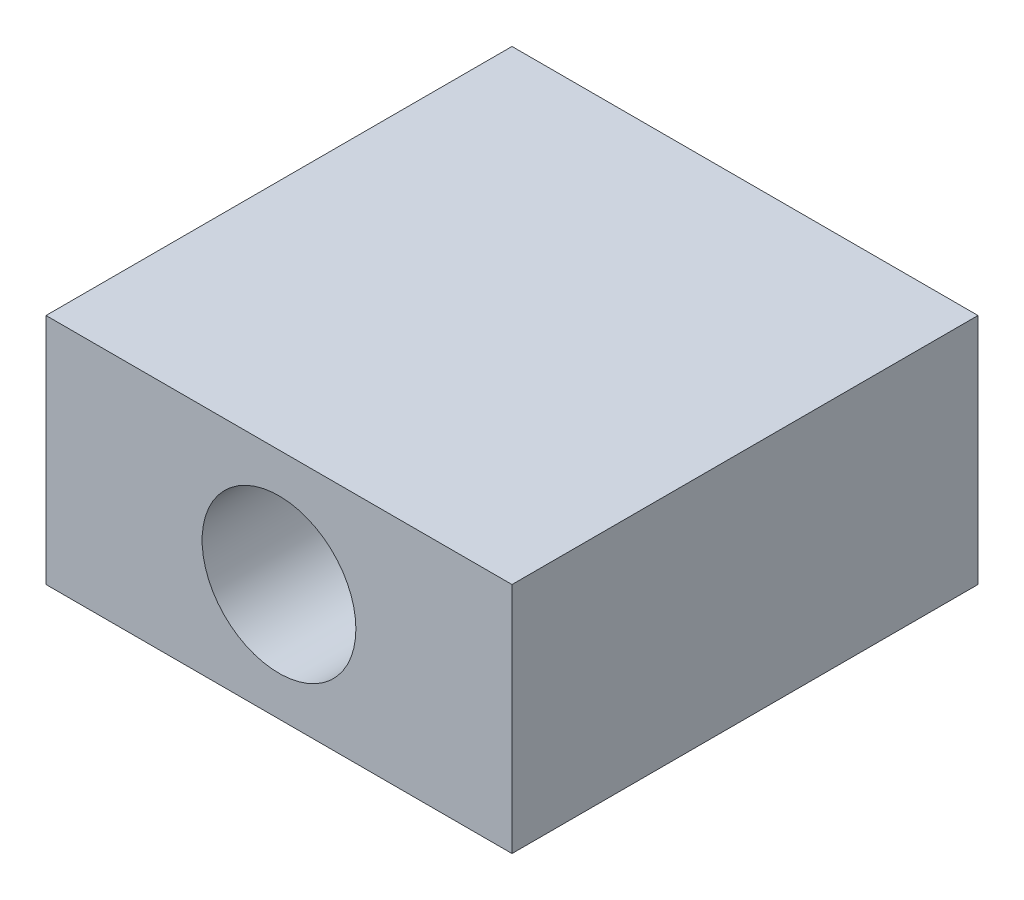
ISO-10303-21;
HEADER;
FILE_DESCRIPTION(('STEP AP214'),'2;1');
FILE_NAME('part.step','',(''),(''),'','','');
FILE_SCHEMA(('AUTOMOTIVE_DESIGN { 1 0 10303 214 1 1 1 1 }'));
ENDSEC;
DATA;
#1=APPLICATION_CONTEXT('core data for automotive mechanical design processes');
#2=APPLICATION_PROTOCOL_DEFINITION('international standard','automotive_design',2000,#1);
#3=PRODUCT_CONTEXT('',#1,'mechanical');
#4=PRODUCT('Part','Part','',(#3));
#5=PRODUCT_RELATED_PRODUCT_CATEGORY('part','',(#4));
#6=PRODUCT_DEFINITION_FORMATION('','',#4);
#7=PRODUCT_DEFINITION_CONTEXT('part definition',#1,'design');
#8=PRODUCT_DEFINITION('design','',#6,#7);
#9=PRODUCT_DEFINITION_SHAPE('','',#8);
#10=(LENGTH_UNIT() NAMED_UNIT(*) SI_UNIT(.MILLI.,.METRE.));
#11=(NAMED_UNIT(*) PLANE_ANGLE_UNIT() SI_UNIT($,.RADIAN.));
#12=(NAMED_UNIT(*) SI_UNIT($,.STERADIAN.) SOLID_ANGLE_UNIT());
#13=UNCERTAINTY_MEASURE_WITH_UNIT(LENGTH_MEASURE(1.E-05),#10,'distance_accuracy_value','');
#14=(GEOMETRIC_REPRESENTATION_CONTEXT(3) GLOBAL_UNCERTAINTY_ASSIGNED_CONTEXT((#13)) GLOBAL_UNIT_ASSIGNED_CONTEXT((#10,
#11,#12)) REPRESENTATION_CONTEXT('',''));
#15=CARTESIAN_POINT('',(0.,0.,0.));
#16=DIRECTION('',(0.,0.,1.));
#17=DIRECTION('',(1.,0.,0.));
#18=AXIS2_PLACEMENT_3D('',#15,#16,#17);
#19=CARTESIAN_POINT('',(0.,0.,20.));
#20=DIRECTION('',(0.,0.,-1.));
#21=DIRECTION('',(-1.,0.,0.));
#22=AXIS2_PLACEMENT_3D('',#19,#20,#21);
#23=PLANE('',#22);
#24=DIRECTION('',(0.,-1.,0.));
#25=VECTOR('',#24,1.);
#26=CARTESIAN_POINT('',(0.,0.,20.));
#27=LINE('',#26,#25);
#28=CARTESIAN_POINT('',(0.,10.,20.));
#29=VERTEX_POINT('',#28);
#30=CARTESIAN_POINT('',(0.,0.,20.));
#31=VERTEX_POINT('',#30);
#32=EDGE_CURVE('E98',#29,#31,#27,.T.);
#33=ORIENTED_EDGE('',*,*,#32,.T.);
#34=DIRECTION('',(1.,0.,0.));
#35=VECTOR('',#34,1.);
#36=CARTESIAN_POINT('',(0.,0.,20.));
#37=LINE('',#36,#35);
#38=CARTESIAN_POINT('',(20.,0.,20.));
#39=VERTEX_POINT('',#38);
#40=EDGE_CURVE('E93',#31,#39,#37,.T.);
#41=ORIENTED_EDGE('',*,*,#40,.T.);
#42=DIRECTION('',(0.,1.,0.));
#43=VECTOR('',#42,1.);
#44=CARTESIAN_POINT('',(20.,0.,20.));
#45=LINE('',#44,#43);
#46=CARTESIAN_POINT('',(20.,10.,20.));
#47=VERTEX_POINT('',#46);
#48=EDGE_CURVE('E96',#39,#47,#45,.T.);
#49=ORIENTED_EDGE('',*,*,#48,.T.);
#50=DIRECTION('',(-1.,0.,0.));
#51=VECTOR('',#50,1.);
#52=CARTESIAN_POINT('',(0.,10.,20.));
#53=LINE('',#52,#51);
#54=EDGE_CURVE('E63',#47,#29,#53,.T.);
#55=ORIENTED_EDGE('',*,*,#54,.T.);
#56=EDGE_LOOP('',(#33,#41,#49,#55));
#57=FACE_BOUND('',#56,.T.);
#58=CARTESIAN_POINT('',(10.,5.,20.));
#59=DIRECTION('',(0.,0.,1.));
#60=DIRECTION('',(1.,0.,0.));
#61=AXIS2_PLACEMENT_3D('',#58,#59,#60);
#62=CIRCLE('',#61,3.3);
#63=CARTESIAN_POINT('',(13.3,5.,20.));
#64=VERTEX_POINT('',#63);
#65=EDGE_CURVE('E119',#64,#64,#62,.T.);
#66=ORIENTED_EDGE('',*,*,#65,.F.);
#67=EDGE_LOOP('',(#66));
#68=FACE_BOUND('',#67,.T.);
#69=ADVANCED_FACE('F45',(#57,#68),#23,.F.);
#70=CARTESIAN_POINT('',(0.,0.,0.));
#71=DIRECTION('',(0.,0.,-1.));
#72=DIRECTION('',(-1.,0.,0.));
#73=AXIS2_PLACEMENT_3D('',#70,#71,#72);
#74=PLANE('',#73);
#75=DIRECTION('',(0.,-1.,0.));
#76=VECTOR('',#75,1.);
#77=CARTESIAN_POINT('',(0.,0.,0.));
#78=LINE('',#77,#76);
#79=CARTESIAN_POINT('',(0.,10.,0.));
#80=VERTEX_POINT('',#79);
#81=CARTESIAN_POINT('',(0.,0.,0.));
#82=VERTEX_POINT('',#81);
#83=EDGE_CURVE('E116',#80,#82,#78,.T.);
#84=ORIENTED_EDGE('',*,*,#83,.F.);
#85=DIRECTION('',(-1.,0.,0.));
#86=VECTOR('',#85,1.);
#87=CARTESIAN_POINT('',(0.,10.,0.));
#88=LINE('',#87,#86);
#89=CARTESIAN_POINT('',(20.,10.,0.));
#90=VERTEX_POINT('',#89);
#91=EDGE_CURVE('E86',#90,#80,#88,.T.);
#92=ORIENTED_EDGE('',*,*,#91,.F.);
#93=DIRECTION('',(0.,1.,0.));
#94=VECTOR('',#93,1.);
#95=CARTESIAN_POINT('',(20.,0.,0.));
#96=LINE('',#95,#94);
#97=CARTESIAN_POINT('',(20.,0.,0.));
#98=VERTEX_POINT('',#97);
#99=EDGE_CURVE('E80',#98,#90,#96,.T.);
#100=ORIENTED_EDGE('',*,*,#99,.F.);
#101=DIRECTION('',(1.,0.,0.));
#102=VECTOR('',#101,1.);
#103=CARTESIAN_POINT('',(0.,0.,0.));
#104=LINE('',#103,#102);
#105=EDGE_CURVE('E103',#82,#98,#104,.T.);
#106=ORIENTED_EDGE('',*,*,#105,.F.);
#107=EDGE_LOOP('',(#84,#92,#100,#106));
#108=FACE_BOUND('',#107,.T.);
#109=CARTESIAN_POINT('',(10.,5.,0.));
#110=DIRECTION('',(0.,0.,1.));
#111=DIRECTION('',(1.,0.,0.));
#112=AXIS2_PLACEMENT_3D('',#109,#110,#111);
#113=CIRCLE('',#112,3.3);
#114=CARTESIAN_POINT('',(13.3,5.,0.));
#115=VERTEX_POINT('',#114);
#116=EDGE_CURVE('E137',#115,#115,#113,.T.);
#117=ORIENTED_EDGE('',*,*,#116,.T.);
#118=EDGE_LOOP('',(#117));
#119=FACE_BOUND('',#118,.T.);
#120=ADVANCED_FACE('F132',(#108,#119),#74,.T.);
#121=CARTESIAN_POINT('',(0.,0.,20.));
#122=DIRECTION('',(1.,0.,0.));
#123=DIRECTION('',(0.,0.,-1.));
#124=AXIS2_PLACEMENT_3D('',#121,#122,#123);
#125=PLANE('',#124);
#126=ORIENTED_EDGE('',*,*,#83,.T.);
#127=DIRECTION('',(0.,0.,-1.));
#128=VECTOR('',#127,1.);
#129=CARTESIAN_POINT('',(0.,0.,20.));
#130=LINE('',#129,#128);
#131=EDGE_CURVE('E11',#31,#82,#130,.T.);
#132=ORIENTED_EDGE('',*,*,#131,.F.);
#133=ORIENTED_EDGE('',*,*,#32,.F.);
#134=DIRECTION('',(0.,0.,-1.));
#135=VECTOR('',#134,1.);
#136=CARTESIAN_POINT('',(0.,10.,20.));
#137=LINE('',#136,#135);
#138=EDGE_CURVE('E112',#29,#80,#137,.T.);
#139=ORIENTED_EDGE('',*,*,#138,.T.);
#140=EDGE_LOOP('',(#126,#132,#133,#139));
#141=FACE_BOUND('',#140,.T.);
#142=ADVANCED_FACE('F47',(#141),#125,.F.);
#143=CARTESIAN_POINT('',(0.,0.,20.));
#144=DIRECTION('',(0.,1.,0.));
#145=DIRECTION('',(0.,0.,1.));
#146=AXIS2_PLACEMENT_3D('',#143,#144,#145);
#147=PLANE('',#146);
#148=ORIENTED_EDGE('',*,*,#105,.T.);
#149=DIRECTION('',(0.,0.,-1.));
#150=VECTOR('',#149,1.);
#151=CARTESIAN_POINT('',(20.,0.,20.));
#152=LINE('',#151,#150);
#153=EDGE_CURVE('E55',#39,#98,#152,.T.);
#154=ORIENTED_EDGE('',*,*,#153,.F.);
#155=ORIENTED_EDGE('',*,*,#40,.F.);
#156=ORIENTED_EDGE('',*,*,#131,.T.);
#157=EDGE_LOOP('',(#148,#154,#155,#156));
#158=FACE_BOUND('',#157,.T.);
#159=ADVANCED_FACE('F102',(#158),#147,.F.);
#160=CARTESIAN_POINT('',(20.,0.,20.));
#161=DIRECTION('',(-1.,0.,0.));
#162=DIRECTION('',(0.,0.,1.));
#163=AXIS2_PLACEMENT_3D('',#160,#161,#162);
#164=PLANE('',#163);
#165=ORIENTED_EDGE('',*,*,#99,.T.);
#166=DIRECTION('',(0.,0.,-1.));
#167=VECTOR('',#166,1.);
#168=CARTESIAN_POINT('',(20.,10.,20.));
#169=LINE('',#168,#167);
#170=EDGE_CURVE('E105',#47,#90,#169,.T.);
#171=ORIENTED_EDGE('',*,*,#170,.F.);
#172=ORIENTED_EDGE('',*,*,#48,.F.);
#173=ORIENTED_EDGE('',*,*,#153,.T.);
#174=EDGE_LOOP('',(#165,#171,#172,#173));
#175=FACE_BOUND('',#174,.T.);
#176=ADVANCED_FACE('F106',(#175),#164,.F.);
#177=CARTESIAN_POINT('',(0.,10.,20.));
#178=DIRECTION('',(0.,-1.,0.));
#179=DIRECTION('',(0.,0.,-1.));
#180=AXIS2_PLACEMENT_3D('',#177,#178,#179);
#181=PLANE('',#180);
#182=ORIENTED_EDGE('',*,*,#91,.T.);
#183=ORIENTED_EDGE('',*,*,#138,.F.);
#184=ORIENTED_EDGE('',*,*,#54,.F.);
#185=ORIENTED_EDGE('',*,*,#170,.T.);
#186=EDGE_LOOP('',(#182,#183,#184,#185));
#187=FACE_BOUND('',#186,.T.);
#188=ADVANCED_FACE('F129',(#187),#181,.F.);
#189=CARTESIAN_POINT('',(10.,5.,20.));
#190=DIRECTION('',(0.,0.,-1.));
#191=DIRECTION('',(-1.,0.,0.));
#192=AXIS2_PLACEMENT_3D('',#189,#190,#191);
#193=CYLINDRICAL_SURFACE('',#192,3.3);
#194=ORIENTED_EDGE('',*,*,#65,.T.);
#195=EDGE_LOOP('',(#194));
#196=FACE_BOUND('',#195,.T.);
#197=ORIENTED_EDGE('',*,*,#116,.F.);
#198=EDGE_LOOP('',(#197));
#199=FACE_BOUND('',#198,.T.);
#200=ADVANCED_FACE('F144',(#196,#199),#193,.F.);
#201=CLOSED_SHELL('',(#69,#120,#142,#159,#176,#188,#200));
#202=MANIFOLD_SOLID_BREP('B2',#201);
#203=ADVANCED_BREP_SHAPE_REPRESENTATION('',(#18,#202),#14);
#204=SHAPE_DEFINITION_REPRESENTATION(#9,#203);
ENDSEC;
END-ISO-10303-21;
